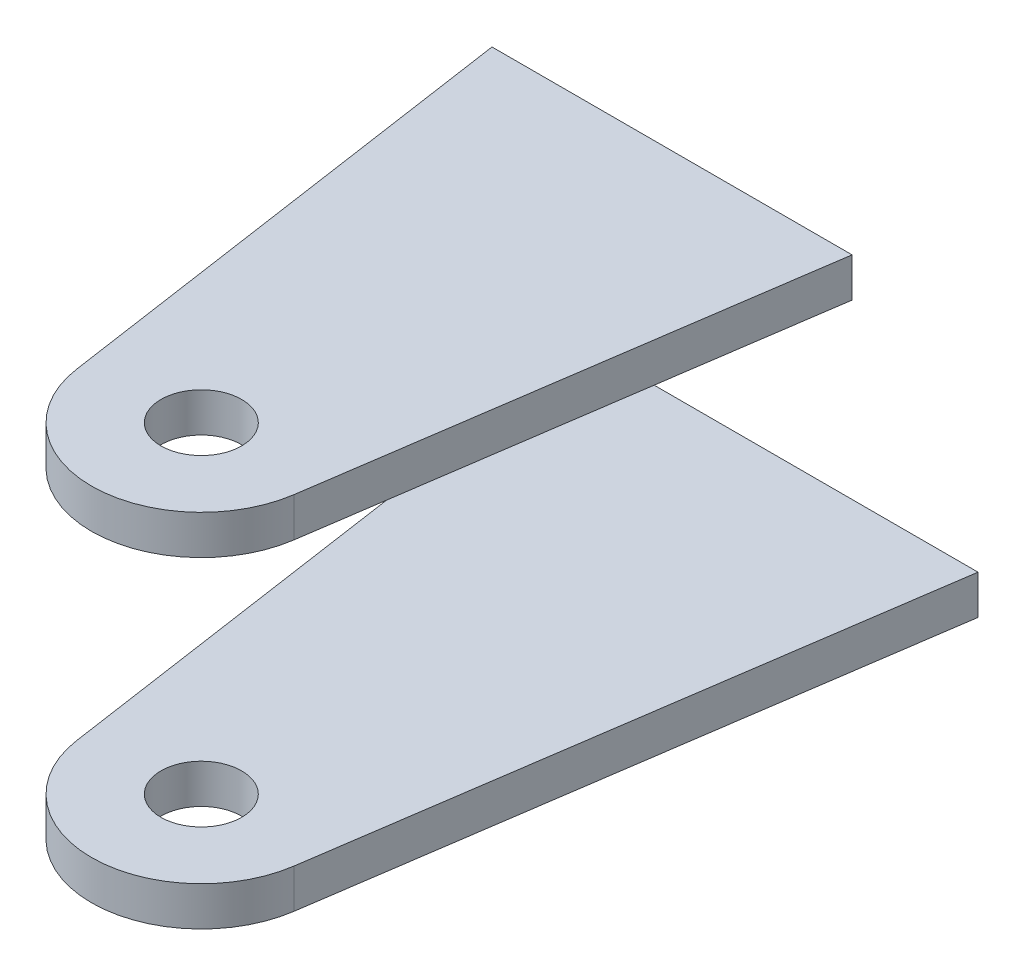
ISO-10303-21;
HEADER;
FILE_DESCRIPTION(('STEP AP214'),'2;1');
FILE_NAME('part.step','',(''),(''),'','','');
FILE_SCHEMA(('AUTOMOTIVE_DESIGN { 1 0 10303 214 1 1 1 1 }'));
ENDSEC;
DATA;
#1=APPLICATION_CONTEXT('core data for automotive mechanical design processes');
#2=APPLICATION_PROTOCOL_DEFINITION('international standard','automotive_design',2000,#1);
#3=PRODUCT_CONTEXT('',#1,'mechanical');
#4=PRODUCT('Part','Part','',(#3));
#5=PRODUCT_RELATED_PRODUCT_CATEGORY('part','',(#4));
#6=PRODUCT_DEFINITION_FORMATION('','',#4);
#7=PRODUCT_DEFINITION_CONTEXT('part definition',#1,'design');
#8=PRODUCT_DEFINITION('design','',#6,#7);
#9=PRODUCT_DEFINITION_SHAPE('','',#8);
#10=(LENGTH_UNIT() NAMED_UNIT(*) SI_UNIT(.MILLI.,.METRE.));
#11=(NAMED_UNIT(*) PLANE_ANGLE_UNIT() SI_UNIT($,.RADIAN.));
#12=(NAMED_UNIT(*) SI_UNIT($,.STERADIAN.) SOLID_ANGLE_UNIT());
#13=UNCERTAINTY_MEASURE_WITH_UNIT(LENGTH_MEASURE(1.E-05),#10,'distance_accuracy_value','');
#14=(GEOMETRIC_REPRESENTATION_CONTEXT(3) GLOBAL_UNCERTAINTY_ASSIGNED_CONTEXT((#13)) GLOBAL_UNIT_ASSIGNED_CONTEXT((#10,
#11,#12)) REPRESENTATION_CONTEXT('',''));
#15=CARTESIAN_POINT('',(0.,0.,0.));
#16=DIRECTION('',(0.,0.,1.));
#17=DIRECTION('',(1.,0.,0.));
#18=AXIS2_PLACEMENT_3D('',#15,#16,#17);
#19=CARTESIAN_POINT('',(0.,-14.605,-46.99));
#20=DIRECTION('',(0.,0.,1.));
#21=DIRECTION('',(1.,0.,0.));
#22=AXIS2_PLACEMENT_3D('',#19,#20,#21);
#23=PLANE('',#22);
#24=DIRECTION('',(1.,0.,0.));
#25=VECTOR('',#24,1.);
#26=CARTESIAN_POINT('',(0.,-11.43,-46.99));
#27=LINE('',#26,#25);
#28=CARTESIAN_POINT('',(-15.875,-11.43,-46.99));
#29=VERTEX_POINT('',#28);
#30=CARTESIAN_POINT('',(15.875,-11.43,-46.99));
#31=VERTEX_POINT('',#30);
#32=EDGE_CURVE('E121',#29,#31,#27,.T.);
#33=ORIENTED_EDGE('',*,*,#32,.T.);
#34=DIRECTION('',(0.,1.,0.));
#35=VECTOR('',#34,1.);
#36=CARTESIAN_POINT('',(15.875,-14.605,-46.99));
#37=LINE('',#36,#35);
#38=CARTESIAN_POINT('',(15.875,-14.605,-46.99));
#39=VERTEX_POINT('',#38);
#40=EDGE_CURVE('E12',#39,#31,#37,.T.);
#41=ORIENTED_EDGE('',*,*,#40,.F.);
#42=DIRECTION('',(1.,0.,0.));
#43=VECTOR('',#42,1.);
#44=CARTESIAN_POINT('',(0.,-14.605,-46.99));
#45=LINE('',#44,#43);
#46=CARTESIAN_POINT('',(-15.875,-14.605,-46.99));
#47=VERTEX_POINT('',#46);
#48=EDGE_CURVE('E73',#47,#39,#45,.T.);
#49=ORIENTED_EDGE('',*,*,#48,.F.);
#50=DIRECTION('',(0.,1.,0.));
#51=VECTOR('',#50,1.);
#52=CARTESIAN_POINT('',(-15.875,-14.605,-46.99));
#53=LINE('',#52,#51);
#54=EDGE_CURVE('E58',#47,#29,#53,.T.);
#55=ORIENTED_EDGE('',*,*,#54,.T.);
#56=EDGE_LOOP('',(#33,#41,#49,#55));
#57=FACE_BOUND('',#56,.T.);
#58=ADVANCED_FACE('F55',(#57),#23,.F.);
#59=CARTESIAN_POINT('',(8.79595023795365,-14.605,1.28971291822758));
#60=DIRECTION('',(0.989420724179263,0.,0.145074568979481));
#61=DIRECTION('',(0.145074568979481,0.,-0.989420724179264));
#62=AXIS2_PLACEMENT_3D('',#59,#60,#61);
#63=PLANE('',#62);
#64=DIRECTION('',(0.145074568979481,0.,-0.989420724179264));
#65=VECTOR('',#64,1.);
#66=CARTESIAN_POINT('',(8.79595023795365,-11.43,1.28971291822758));
#67=LINE('',#66,#65);
#68=CARTESIAN_POINT('',(8.79595023795365,-11.43,1.28971291822759));
#69=VERTEX_POINT('',#68);
#70=EDGE_CURVE('E126',#69,#31,#67,.T.);
#71=ORIENTED_EDGE('',*,*,#70,.F.);
#72=DIRECTION('',(0.,1.,0.));
#73=VECTOR('',#72,1.);
#74=CARTESIAN_POINT('',(8.79595023795365,-14.605,1.28971291822759));
#75=LINE('',#74,#73);
#76=CARTESIAN_POINT('',(8.79595023795365,-14.605,1.28971291822759));
#77=VERTEX_POINT('',#76);
#78=EDGE_CURVE('E64',#77,#69,#75,.T.);
#79=ORIENTED_EDGE('',*,*,#78,.F.);
#80=DIRECTION('',(0.145074568979481,0.,-0.989420724179264));
#81=VECTOR('',#80,1.);
#82=CARTESIAN_POINT('',(8.79595023795365,-14.605,1.28971291822758));
#83=LINE('',#82,#81);
#84=EDGE_CURVE('E113',#77,#39,#83,.T.);
#85=ORIENTED_EDGE('',*,*,#84,.T.);
#86=ORIENTED_EDGE('',*,*,#40,.T.);
#87=EDGE_LOOP('',(#71,#79,#85,#86));
#88=FACE_BOUND('',#87,.T.);
#89=ADVANCED_FACE('F147',(#88),#63,.T.);
#90=CARTESIAN_POINT('',(0.,-14.605,0.));
#91=DIRECTION('',(0.,1.,0.));
#92=DIRECTION('',(0.,0.,1.));
#93=AXIS2_PLACEMENT_3D('',#90,#91,#92);
#94=CYLINDRICAL_SURFACE('',#93,8.89);
#95=CARTESIAN_POINT('',(0.,-11.43,0.));
#96=DIRECTION('',(0.,1.,0.));
#97=DIRECTION('',(0.,0.,1.));
#98=AXIS2_PLACEMENT_3D('',#95,#96,#97);
#99=CIRCLE('',#98,8.89);
#100=CARTESIAN_POINT('',(-8.79595023795365,-11.43,1.28971291822759));
#101=VERTEX_POINT('',#100);
#102=EDGE_CURVE('E105',#101,#69,#99,.T.);
#103=ORIENTED_EDGE('',*,*,#102,.F.);
#104=DIRECTION('',(0.,1.,0.));
#105=VECTOR('',#104,1.);
#106=CARTESIAN_POINT('',(-8.79595023795365,-14.605,1.28971291822759));
#107=LINE('',#106,#105);
#108=CARTESIAN_POINT('',(-8.79595023795365,-14.605,1.28971291822759));
#109=VERTEX_POINT('',#108);
#110=EDGE_CURVE('E102',#109,#101,#107,.T.);
#111=ORIENTED_EDGE('',*,*,#110,.F.);
#112=CARTESIAN_POINT('',(0.,-14.605,0.));
#113=DIRECTION('',(0.,1.,0.));
#114=DIRECTION('',(0.,0.,1.));
#115=AXIS2_PLACEMENT_3D('',#112,#113,#114);
#116=CIRCLE('',#115,8.89);
#117=EDGE_CURVE('E104',#109,#77,#116,.T.);
#118=ORIENTED_EDGE('',*,*,#117,.T.);
#119=ORIENTED_EDGE('',*,*,#78,.T.);
#120=EDGE_LOOP('',(#103,#111,#118,#119));
#121=FACE_BOUND('',#120,.T.);
#122=ADVANCED_FACE('F103',(#121),#94,.T.);
#123=CARTESIAN_POINT('',(-8.79595023795365,-14.605,1.28971291822758));
#124=DIRECTION('',(0.989420724179263,0.,-0.145074568979481));
#125=DIRECTION('',(-0.145074568979481,0.,-0.989420724179264));
#126=AXIS2_PLACEMENT_3D('',#123,#124,#125);
#127=PLANE('',#126);
#128=DIRECTION('',(-0.145074568979481,0.,-0.989420724179264));
#129=VECTOR('',#128,1.);
#130=CARTESIAN_POINT('',(-8.79595023795365,-11.43,1.28971291822758));
#131=LINE('',#130,#129);
#132=EDGE_CURVE('E123',#101,#29,#131,.T.);
#133=ORIENTED_EDGE('',*,*,#132,.T.);
#134=ORIENTED_EDGE('',*,*,#54,.F.);
#135=DIRECTION('',(-0.145074568979481,0.,-0.989420724179264));
#136=VECTOR('',#135,1.);
#137=CARTESIAN_POINT('',(-8.79595023795365,-14.605,1.28971291822758));
#138=LINE('',#137,#136);
#139=EDGE_CURVE('E99',#109,#47,#138,.T.);
#140=ORIENTED_EDGE('',*,*,#139,.F.);
#141=ORIENTED_EDGE('',*,*,#110,.T.);
#142=EDGE_LOOP('',(#133,#134,#140,#141));
#143=FACE_BOUND('',#142,.T.);
#144=ADVANCED_FACE('F108',(#143),#127,.F.);
#145=CARTESIAN_POINT('',(0.,-14.605,0.));
#146=DIRECTION('',(0.,1.,0.));
#147=DIRECTION('',(0.,0.,1.));
#148=AXIS2_PLACEMENT_3D('',#145,#146,#147);
#149=CYLINDRICAL_SURFACE('',#148,3.2639);
#150=CARTESIAN_POINT('',(0.,-14.605,0.));
#151=DIRECTION('',(0.,1.,0.));
#152=DIRECTION('',(0.,0.,1.));
#153=AXIS2_PLACEMENT_3D('',#150,#151,#152);
#154=CIRCLE('',#153,3.2639);
#155=CARTESIAN_POINT('',(0.,-14.605,3.2639));
#156=VERTEX_POINT('',#155);
#157=EDGE_CURVE('E115',#156,#156,#154,.T.);
#158=ORIENTED_EDGE('',*,*,#157,.F.);
#159=EDGE_LOOP('',(#158));
#160=FACE_BOUND('',#159,.T.);
#161=CARTESIAN_POINT('',(0.,-11.43,0.));
#162=DIRECTION('',(0.,1.,0.));
#163=DIRECTION('',(0.,0.,1.));
#164=AXIS2_PLACEMENT_3D('',#161,#162,#163);
#165=CIRCLE('',#164,3.2639);
#166=CARTESIAN_POINT('',(0.,-11.43,3.2639));
#167=VERTEX_POINT('',#166);
#168=EDGE_CURVE('E129',#167,#167,#165,.T.);
#169=ORIENTED_EDGE('',*,*,#168,.T.);
#170=EDGE_LOOP('',(#169));
#171=FACE_BOUND('',#170,.T.);
#172=ADVANCED_FACE('F134',(#160,#171),#149,.F.);
#173=CARTESIAN_POINT('',(0.,-14.605,0.));
#174=DIRECTION('',(0.,1.,0.));
#175=DIRECTION('',(0.,0.,1.));
#176=AXIS2_PLACEMENT_3D('',#173,#174,#175);
#177=PLANE('',#176);
#178=ORIENTED_EDGE('',*,*,#48,.T.);
#179=ORIENTED_EDGE('',*,*,#84,.F.);
#180=ORIENTED_EDGE('',*,*,#117,.F.);
#181=ORIENTED_EDGE('',*,*,#139,.T.);
#182=EDGE_LOOP('',(#178,#179,#180,#181));
#183=FACE_BOUND('',#182,.T.);
#184=ORIENTED_EDGE('',*,*,#157,.T.);
#185=EDGE_LOOP('',(#184));
#186=FACE_BOUND('',#185,.T.);
#187=ADVANCED_FACE('F111',(#183,#186),#177,.F.);
#188=CARTESIAN_POINT('',(0.,-11.43,0.));
#189=DIRECTION('',(0.,1.,0.));
#190=DIRECTION('',(0.,0.,1.));
#191=AXIS2_PLACEMENT_3D('',#188,#189,#190);
#192=PLANE('',#191);
#193=ORIENTED_EDGE('',*,*,#32,.F.);
#194=ORIENTED_EDGE('',*,*,#132,.F.);
#195=ORIENTED_EDGE('',*,*,#102,.T.);
#196=ORIENTED_EDGE('',*,*,#70,.T.);
#197=EDGE_LOOP('',(#193,#194,#195,#196));
#198=FACE_BOUND('',#197,.T.);
#199=ORIENTED_EDGE('',*,*,#168,.F.);
#200=EDGE_LOOP('',(#199));
#201=FACE_BOUND('',#200,.T.);
#202=ADVANCED_FACE('F136',(#198,#201),#192,.T.);
#203=CLOSED_SHELL('',(#58,#89,#122,#144,#172,#187,#202));
#204=MANIFOLD_SOLID_BREP('B2',#203);
#205=CARTESIAN_POINT('',(-8.79595023795365,14.605,1.28971291822758));
#206=DIRECTION('',(-0.989420724179263,0.,0.145074568979481));
#207=DIRECTION('',(0.145074568979481,0.,0.989420724179264));
#208=AXIS2_PLACEMENT_3D('',#205,#206,#207);
#209=PLANE('',#208);
#210=DIRECTION('',(-0.145074568979481,0.,-0.989420724179264));
#211=VECTOR('',#210,1.);
#212=CARTESIAN_POINT('',(-8.79595023795365,11.43,1.28971291822758));
#213=LINE('',#212,#211);
#214=CARTESIAN_POINT('',(-8.79595023795365,11.43,1.28971291822759));
#215=VERTEX_POINT('',#214);
#216=CARTESIAN_POINT('',(-14.5714969636174,11.43,-38.1));
#217=VERTEX_POINT('',#216);
#218=EDGE_CURVE('E291',#215,#217,#213,.T.);
#219=ORIENTED_EDGE('',*,*,#218,.F.);
#220=DIRECTION('',(0.,-1.,0.));
#221=VECTOR('',#220,1.);
#222=CARTESIAN_POINT('',(-8.79595023795365,14.605,1.28971291822759));
#223=LINE('',#222,#221);
#224=CARTESIAN_POINT('',(-8.79595023795365,14.605,1.28971291822759));
#225=VERTEX_POINT('',#224);
#226=EDGE_CURVE('E53',#225,#215,#223,.T.);
#227=ORIENTED_EDGE('',*,*,#226,.F.);
#228=DIRECTION('',(-0.145074568979481,0.,-0.989420724179264));
#229=VECTOR('',#228,1.);
#230=CARTESIAN_POINT('',(-8.79595023795365,14.605,1.28971291822758));
#231=LINE('',#230,#229);
#232=CARTESIAN_POINT('',(-14.5714969636174,14.605,-38.1));
#233=VERTEX_POINT('',#232);
#234=EDGE_CURVE('E273',#225,#233,#231,.T.);
#235=ORIENTED_EDGE('',*,*,#234,.T.);
#236=DIRECTION('',(0.,-1.,0.));
#237=VECTOR('',#236,1.);
#238=CARTESIAN_POINT('',(-14.5714969636174,14.605,-38.1));
#239=LINE('',#238,#237);
#240=EDGE_CURVE('E240',#233,#217,#239,.T.);
#241=ORIENTED_EDGE('',*,*,#240,.T.);
#242=EDGE_LOOP('',(#219,#227,#235,#241));
#243=FACE_BOUND('',#242,.T.);
#244=ADVANCED_FACE('F224',(#243),#209,.T.);
#245=CARTESIAN_POINT('',(0.,14.605,0.));
#246=DIRECTION('',(0.,-1.,0.));
#247=DIRECTION('',(0.,0.,-1.));
#248=AXIS2_PLACEMENT_3D('',#245,#246,#247);
#249=CYLINDRICAL_SURFACE('',#248,8.89);
#250=CARTESIAN_POINT('',(0.,11.43,0.));
#251=DIRECTION('',(0.,1.,0.));
#252=DIRECTION('',(0.,0.,1.));
#253=AXIS2_PLACEMENT_3D('',#250,#251,#252);
#254=CIRCLE('',#253,8.89);
#255=CARTESIAN_POINT('',(8.79595023795365,11.43,1.28971291822759));
#256=VERTEX_POINT('',#255);
#257=EDGE_CURVE('E279',#215,#256,#254,.T.);
#258=ORIENTED_EDGE('',*,*,#257,.T.);
#259=DIRECTION('',(0.,-1.,0.));
#260=VECTOR('',#259,1.);
#261=CARTESIAN_POINT('',(8.79595023795365,14.605,1.28971291822759));
#262=LINE('',#261,#260);
#263=CARTESIAN_POINT('',(8.79595023795365,14.605,1.28971291822759));
#264=VERTEX_POINT('',#263);
#265=EDGE_CURVE('E232',#264,#256,#262,.T.);
#266=ORIENTED_EDGE('',*,*,#265,.F.);
#267=CARTESIAN_POINT('',(0.,14.605,0.));
#268=DIRECTION('',(0.,1.,0.));
#269=DIRECTION('',(0.,0.,1.));
#270=AXIS2_PLACEMENT_3D('',#267,#268,#269);
#271=CIRCLE('',#270,8.89);
#272=EDGE_CURVE('E266',#225,#264,#271,.T.);
#273=ORIENTED_EDGE('',*,*,#272,.F.);
#274=ORIENTED_EDGE('',*,*,#226,.T.);
#275=EDGE_LOOP('',(#258,#266,#273,#274));
#276=FACE_BOUND('',#275,.T.);
#277=ADVANCED_FACE('F277',(#276),#249,.T.);
#278=CARTESIAN_POINT('',(8.79595023795365,14.605,1.28971291822758));
#279=DIRECTION('',(-0.989420724179263,0.,-0.145074568979481));
#280=DIRECTION('',(-0.145074568979481,0.,0.989420724179264));
#281=AXIS2_PLACEMENT_3D('',#278,#279,#280);
#282=PLANE('',#281);
#283=DIRECTION('',(0.145074568979481,0.,-0.989420724179264));
#284=VECTOR('',#283,1.);
#285=CARTESIAN_POINT('',(8.79595023795365,11.43,1.28971291822758));
#286=LINE('',#285,#284);
#287=CARTESIAN_POINT('',(14.5714969636174,11.43,-38.1));
#288=VERTEX_POINT('',#287);
#289=EDGE_CURVE('E294',#256,#288,#286,.T.);
#290=ORIENTED_EDGE('',*,*,#289,.T.);
#291=DIRECTION('',(0.,-1.,0.));
#292=VECTOR('',#291,1.);
#293=CARTESIAN_POINT('',(14.5714969636174,14.605,-38.1));
#294=LINE('',#293,#292);
#295=CARTESIAN_POINT('',(14.5714969636174,14.605,-38.1));
#296=VERTEX_POINT('',#295);
#297=EDGE_CURVE('E254',#296,#288,#294,.T.);
#298=ORIENTED_EDGE('',*,*,#297,.F.);
#299=DIRECTION('',(0.145074568979481,0.,-0.989420724179264));
#300=VECTOR('',#299,1.);
#301=CARTESIAN_POINT('',(8.79595023795365,14.605,1.28971291822758));
#302=LINE('',#301,#300);
#303=EDGE_CURVE('E272',#264,#296,#302,.T.);
#304=ORIENTED_EDGE('',*,*,#303,.F.);
#305=ORIENTED_EDGE('',*,*,#265,.T.);
#306=EDGE_LOOP('',(#290,#298,#304,#305));
#307=FACE_BOUND('',#306,.T.);
#308=ADVANCED_FACE('F282',(#307),#282,.F.);
#309=CARTESIAN_POINT('',(0.,14.605,-38.1));
#310=DIRECTION('',(0.,0.,-1.));
#311=DIRECTION('',(-1.,0.,0.));
#312=AXIS2_PLACEMENT_3D('',#309,#310,#311);
#313=PLANE('',#312);
#314=DIRECTION('',(1.,0.,0.));
#315=VECTOR('',#314,1.);
#316=CARTESIAN_POINT('',(0.,11.43,-38.1));
#317=LINE('',#316,#315);
#318=EDGE_CURVE('E296',#217,#288,#317,.T.);
#319=ORIENTED_EDGE('',*,*,#318,.F.);
#320=ORIENTED_EDGE('',*,*,#240,.F.);
#321=DIRECTION('',(1.,0.,0.));
#322=VECTOR('',#321,1.);
#323=CARTESIAN_POINT('',(0.,14.605,-38.1));
#324=LINE('',#323,#322);
#325=EDGE_CURVE('E283',#233,#296,#324,.T.);
#326=ORIENTED_EDGE('',*,*,#325,.T.);
#327=ORIENTED_EDGE('',*,*,#297,.T.);
#328=EDGE_LOOP('',(#319,#320,#326,#327));
#329=FACE_BOUND('',#328,.T.);
#330=ADVANCED_FACE('F305',(#329),#313,.T.);
#331=CARTESIAN_POINT('',(0.,14.605,0.));
#332=DIRECTION('',(0.,-1.,0.));
#333=DIRECTION('',(0.,0.,-1.));
#334=AXIS2_PLACEMENT_3D('',#331,#332,#333);
#335=CYLINDRICAL_SURFACE('',#334,3.2639);
#336=CARTESIAN_POINT('',(0.,14.605,0.));
#337=DIRECTION('',(0.,1.,0.));
#338=DIRECTION('',(0.,0.,1.));
#339=AXIS2_PLACEMENT_3D('',#336,#337,#338);
#340=CIRCLE('',#339,3.2639);
#341=CARTESIAN_POINT('',(0.,14.605,3.2639));
#342=VERTEX_POINT('',#341);
#343=EDGE_CURVE('E285',#342,#342,#340,.T.);
#344=ORIENTED_EDGE('',*,*,#343,.T.);
#345=EDGE_LOOP('',(#344));
#346=FACE_BOUND('',#345,.T.);
#347=CARTESIAN_POINT('',(0.,11.43,0.));
#348=DIRECTION('',(0.,1.,0.));
#349=DIRECTION('',(0.,0.,1.));
#350=AXIS2_PLACEMENT_3D('',#347,#348,#349);
#351=CIRCLE('',#350,3.2639);
#352=CARTESIAN_POINT('',(0.,11.43,3.2639));
#353=VERTEX_POINT('',#352);
#354=EDGE_CURVE('E299',#353,#353,#351,.T.);
#355=ORIENTED_EDGE('',*,*,#354,.F.);
#356=EDGE_LOOP('',(#355));
#357=FACE_BOUND('',#356,.T.);
#358=ADVANCED_FACE('F307',(#346,#357),#335,.F.);
#359=CARTESIAN_POINT('',(0.,14.605,0.));
#360=DIRECTION('',(0.,1.,0.));
#361=DIRECTION('',(0.,0.,1.));
#362=AXIS2_PLACEMENT_3D('',#359,#360,#361);
#363=PLANE('',#362);
#364=ORIENTED_EDGE('',*,*,#234,.F.);
#365=ORIENTED_EDGE('',*,*,#272,.T.);
#366=ORIENTED_EDGE('',*,*,#303,.T.);
#367=ORIENTED_EDGE('',*,*,#325,.F.);
#368=EDGE_LOOP('',(#364,#365,#366,#367));
#369=FACE_BOUND('',#368,.T.);
#370=ORIENTED_EDGE('',*,*,#343,.F.);
#371=EDGE_LOOP('',(#370));
#372=FACE_BOUND('',#371,.T.);
#373=ADVANCED_FACE('F268',(#369,#372),#363,.T.);
#374=CARTESIAN_POINT('',(0.,11.43,0.));
#375=DIRECTION('',(0.,1.,0.));
#376=DIRECTION('',(0.,0.,1.));
#377=AXIS2_PLACEMENT_3D('',#374,#375,#376);
#378=PLANE('',#377);
#379=ORIENTED_EDGE('',*,*,#218,.T.);
#380=ORIENTED_EDGE('',*,*,#318,.T.);
#381=ORIENTED_EDGE('',*,*,#289,.F.);
#382=ORIENTED_EDGE('',*,*,#257,.F.);
#383=EDGE_LOOP('',(#379,#380,#381,#382));
#384=FACE_BOUND('',#383,.T.);
#385=ORIENTED_EDGE('',*,*,#354,.T.);
#386=EDGE_LOOP('',(#385));
#387=FACE_BOUND('',#386,.T.);
#388=ADVANCED_FACE('F347',(#384,#387),#378,.F.);
#389=CLOSED_SHELL('',(#244,#277,#308,#330,#358,#373,#388));
#390=MANIFOLD_SOLID_BREP('B6',#389);
#391=ADVANCED_BREP_SHAPE_REPRESENTATION('',(#18,#204,#390),#14);
#392=SHAPE_DEFINITION_REPRESENTATION(#9,#391);
ENDSEC;
END-ISO-10303-21;
